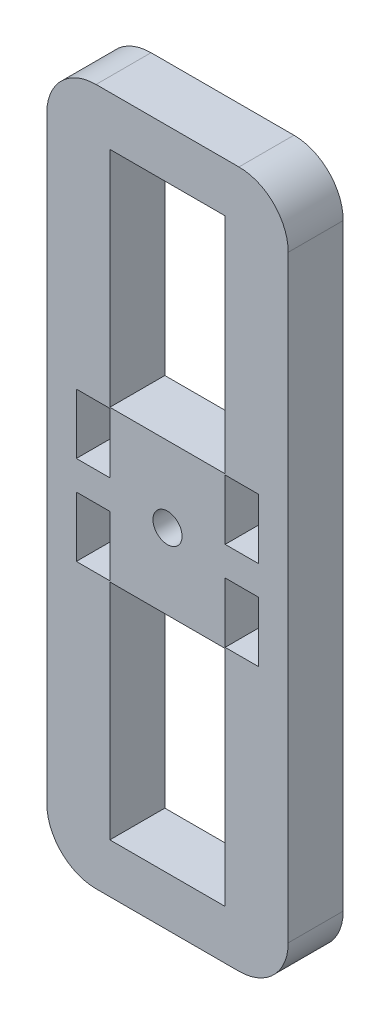
ISO-10303-21;
HEADER;
FILE_DESCRIPTION(('STEP AP214'),'2;1');
FILE_NAME('part.step','',(''),(''),'','','');
FILE_SCHEMA(('AUTOMOTIVE_DESIGN { 1 0 10303 214 1 1 1 1 }'));
ENDSEC;
DATA;
#1=APPLICATION_CONTEXT('core data for automotive mechanical design processes');
#2=APPLICATION_PROTOCOL_DEFINITION('international standard','automotive_design',2000,#1);
#3=PRODUCT_CONTEXT('',#1,'mechanical');
#4=PRODUCT('Part','Part','',(#3));
#5=PRODUCT_RELATED_PRODUCT_CATEGORY('part','',(#4));
#6=PRODUCT_DEFINITION_FORMATION('','',#4);
#7=PRODUCT_DEFINITION_CONTEXT('part definition',#1,'design');
#8=PRODUCT_DEFINITION('design','',#6,#7);
#9=PRODUCT_DEFINITION_SHAPE('','',#8);
#10=(LENGTH_UNIT() NAMED_UNIT(*) SI_UNIT(.MILLI.,.METRE.));
#11=(NAMED_UNIT(*) PLANE_ANGLE_UNIT() SI_UNIT($,.RADIAN.));
#12=(NAMED_UNIT(*) SI_UNIT($,.STERADIAN.) SOLID_ANGLE_UNIT());
#13=UNCERTAINTY_MEASURE_WITH_UNIT(LENGTH_MEASURE(1.E-05),#10,'distance_accuracy_value','');
#14=(GEOMETRIC_REPRESENTATION_CONTEXT(3) GLOBAL_UNCERTAINTY_ASSIGNED_CONTEXT((#13)) GLOBAL_UNIT_ASSIGNED_CONTEXT((#10,
#11,#12)) REPRESENTATION_CONTEXT('',''));
#15=CARTESIAN_POINT('',(0.,0.,0.));
#16=DIRECTION('',(0.,0.,1.));
#17=DIRECTION('',(1.,0.,0.));
#18=AXIS2_PLACEMENT_3D('',#15,#16,#17);
#19=CARTESIAN_POINT('',(715.695729088939,432.610180658426,5.58));
#20=DIRECTION('',(0.,1.,0.));
#21=DIRECTION('',(-1.,0.,0.));
#22=AXIS2_PLACEMENT_3D('',#19,#20,#21);
#23=PLANE('',#22);
#24=DIRECTION('',(1.,0.,0.));
#25=VECTOR('',#24,1.);
#26=CARTESIAN_POINT('',(715.695729088939,432.610180658426,0.));
#27=LINE('',#26,#25);
#28=CARTESIAN_POINT('',(708.445729088938,432.610180658425,0.));
#29=VERTEX_POINT('',#28);
#30=CARTESIAN_POINT('',(722.945729088939,432.610180658425,0.));
#31=VERTEX_POINT('',#30);
#32=EDGE_CURVE('E355',#29,#31,#27,.T.);
#33=ORIENTED_EDGE('',*,*,#32,.T.);
#34=DIRECTION('',(0.,0.,-1.));
#35=VECTOR('',#34,1.);
#36=CARTESIAN_POINT('',(722.945729088939,432.610180658425,5.58));
#37=LINE('',#36,#35);
#38=CARTESIAN_POINT('',(722.945729088939,432.610180658425,5.58));
#39=VERTEX_POINT('',#38);
#40=EDGE_CURVE('E12',#39,#31,#37,.T.);
#41=ORIENTED_EDGE('',*,*,#40,.F.);
#42=DIRECTION('',(1.,0.,0.));
#43=VECTOR('',#42,1.);
#44=CARTESIAN_POINT('',(715.695729088939,432.610180658426,5.58));
#45=LINE('',#44,#43);
#46=CARTESIAN_POINT('',(708.445729088938,432.610180658425,5.58));
#47=VERTEX_POINT('',#46);
#48=EDGE_CURVE('E585',#47,#39,#45,.T.);
#49=ORIENTED_EDGE('',*,*,#48,.F.);
#50=DIRECTION('',(0.,0.,-1.));
#51=VECTOR('',#50,1.);
#52=CARTESIAN_POINT('',(708.445729088938,432.610180658425,5.58));
#53=LINE('',#52,#51);
#54=EDGE_CURVE('E55',#47,#29,#53,.T.);
#55=ORIENTED_EDGE('',*,*,#54,.T.);
#56=EDGE_LOOP('',(#33,#41,#49,#55));
#57=FACE_BOUND('',#56,.T.);
#58=ADVANCED_FACE('F36',(#57),#23,.F.);
#59=CARTESIAN_POINT('',(722.945729088939,437.610180658425,5.58));
#60=DIRECTION('',(0.,0.,-1.));
#61=DIRECTION('',(-1.,0.,0.));
#62=AXIS2_PLACEMENT_3D('',#59,#60,#61);
#63=CYLINDRICAL_SURFACE('',#62,4.99999999999992);
#64=CARTESIAN_POINT('',(722.945729088939,437.610180658425,0.));
#65=DIRECTION('',(0.,0.,1.));
#66=DIRECTION('',(1.,0.,0.));
#67=AXIS2_PLACEMENT_3D('',#64,#65,#66);
#68=CIRCLE('',#67,4.99999999999992);
#69=CARTESIAN_POINT('',(727.945729088939,437.610180658426,0.));
#70=VERTEX_POINT('',#69);
#71=EDGE_CURVE('E357',#31,#70,#68,.T.);
#72=ORIENTED_EDGE('',*,*,#71,.T.);
#73=DIRECTION('',(0.,0.,-1.));
#74=VECTOR('',#73,1.);
#75=CARTESIAN_POINT('',(727.945729088939,437.610180658426,5.58));
#76=LINE('',#75,#74);
#77=CARTESIAN_POINT('',(727.945729088939,437.610180658426,5.58));
#78=VERTEX_POINT('',#77);
#79=EDGE_CURVE('E46',#78,#70,#76,.T.);
#80=ORIENTED_EDGE('',*,*,#79,.F.);
#81=CARTESIAN_POINT('',(722.945729088939,437.610180658425,5.58));
#82=DIRECTION('',(0.,0.,1.));
#83=DIRECTION('',(1.,0.,0.));
#84=AXIS2_PLACEMENT_3D('',#81,#82,#83);
#85=CIRCLE('',#84,4.99999999999992);
#86=EDGE_CURVE('E589',#39,#78,#85,.T.);
#87=ORIENTED_EDGE('',*,*,#86,.F.);
#88=ORIENTED_EDGE('',*,*,#40,.T.);
#89=EDGE_LOOP('',(#72,#80,#87,#88));
#90=FACE_BOUND('',#89,.T.);
#91=ADVANCED_FACE('F613',(#90),#63,.T.);
#92=CARTESIAN_POINT('',(727.945729088939,409.621367447579,5.58));
#93=DIRECTION('',(1.,0.,0.));
#94=DIRECTION('',(0.,1.,0.));
#95=AXIS2_PLACEMENT_3D('',#92,#93,#94);
#96=PLANE('',#95);
#97=DIRECTION('',(0.,-1.,0.));
#98=VECTOR('',#97,1.);
#99=CARTESIAN_POINT('',(727.945729088939,409.621367447579,0.));
#100=LINE('',#99,#98);
#101=CARTESIAN_POINT('',(727.945729088939,498.299163154582,0.));
#102=VERTEX_POINT('',#101);
#103=EDGE_CURVE('E360',#102,#70,#100,.T.);
#104=ORIENTED_EDGE('',*,*,#103,.F.);
#105=DIRECTION('',(0.,0.,-1.));
#106=VECTOR('',#105,1.);
#107=CARTESIAN_POINT('',(727.945729088939,498.299163154582,5.58));
#108=LINE('',#107,#106);
#109=CARTESIAN_POINT('',(727.945729088939,498.299163154582,5.58));
#110=VERTEX_POINT('',#109);
#111=EDGE_CURVE('E382',#110,#102,#108,.T.);
#112=ORIENTED_EDGE('',*,*,#111,.F.);
#113=DIRECTION('',(0.,-1.,0.));
#114=VECTOR('',#113,1.);
#115=CARTESIAN_POINT('',(727.945729088939,409.621367447579,5.58));
#116=LINE('',#115,#114);
#117=EDGE_CURVE('E593',#110,#78,#116,.T.);
#118=ORIENTED_EDGE('',*,*,#117,.T.);
#119=ORIENTED_EDGE('',*,*,#79,.T.);
#120=EDGE_LOOP('',(#104,#112,#118,#119));
#121=FACE_BOUND('',#120,.T.);
#122=ADVANCED_FACE('F609',(#121),#96,.T.);
#123=CARTESIAN_POINT('',(722.945729088939,498.299163154582,5.58));
#124=DIRECTION('',(0.,0.,-1.));
#125=DIRECTION('',(-1.,0.,0.));
#126=AXIS2_PLACEMENT_3D('',#123,#124,#125);
#127=CYLINDRICAL_SURFACE('',#126,4.99999999999987);
#128=CARTESIAN_POINT('',(722.945729088939,498.299163154582,0.));
#129=DIRECTION('',(0.,0.,1.));
#130=DIRECTION('',(1.,0.,0.));
#131=AXIS2_PLACEMENT_3D('',#128,#129,#130);
#132=CIRCLE('',#131,4.99999999999987);
#133=CARTESIAN_POINT('',(722.945729088939,503.299163154582,0.));
#134=VERTEX_POINT('',#133);
#135=EDGE_CURVE('E363',#134,#102,#132,.F.);
#136=ORIENTED_EDGE('',*,*,#135,.F.);
#137=DIRECTION('',(0.,0.,-1.));
#138=VECTOR('',#137,1.);
#139=CARTESIAN_POINT('',(722.945729088939,503.299163154582,5.58));
#140=LINE('',#139,#138);
#141=CARTESIAN_POINT('',(722.945729088939,503.299163154582,5.58));
#142=VERTEX_POINT('',#141);
#143=EDGE_CURVE('E380',#142,#134,#140,.T.);
#144=ORIENTED_EDGE('',*,*,#143,.F.);
#145=CARTESIAN_POINT('',(722.945729088939,498.299163154582,5.58));
#146=DIRECTION('',(0.,0.,1.));
#147=DIRECTION('',(1.,0.,0.));
#148=AXIS2_PLACEMENT_3D('',#145,#146,#147);
#149=CIRCLE('',#148,4.99999999999987);
#150=EDGE_CURVE('E600',#142,#110,#149,.F.);
#151=ORIENTED_EDGE('',*,*,#150,.T.);
#152=ORIENTED_EDGE('',*,*,#111,.T.);
#153=EDGE_LOOP('',(#136,#144,#151,#152));
#154=FACE_BOUND('',#153,.T.);
#155=ADVANCED_FACE('F617',(#154),#127,.T.);
#156=CARTESIAN_POINT('',(715.695729088937,503.299163154582,5.58));
#157=DIRECTION('',(0.,1.,0.));
#158=DIRECTION('',(-1.,0.,0.));
#159=AXIS2_PLACEMENT_3D('',#156,#157,#158);
#160=PLANE('',#159);
#161=DIRECTION('',(1.,0.,0.));
#162=VECTOR('',#161,1.);
#163=CARTESIAN_POINT('',(715.695729088937,503.299163154582,0.));
#164=LINE('',#163,#162);
#165=CARTESIAN_POINT('',(708.445729088938,503.299163154582,0.));
#166=VERTEX_POINT('',#165);
#167=EDGE_CURVE('E366',#166,#134,#164,.T.);
#168=ORIENTED_EDGE('',*,*,#167,.F.);
#169=DIRECTION('',(0.,0.,-1.));
#170=VECTOR('',#169,1.);
#171=CARTESIAN_POINT('',(708.445729088938,503.299163154582,5.58));
#172=LINE('',#171,#170);
#173=CARTESIAN_POINT('',(708.445729088938,503.299163154582,5.58));
#174=VERTEX_POINT('',#173);
#175=EDGE_CURVE('E274',#174,#166,#172,.T.);
#176=ORIENTED_EDGE('',*,*,#175,.F.);
#177=DIRECTION('',(1.,0.,0.));
#178=VECTOR('',#177,1.);
#179=CARTESIAN_POINT('',(715.695729088937,503.299163154582,5.58));
#180=LINE('',#179,#178);
#181=EDGE_CURVE('E263',#174,#142,#180,.T.);
#182=ORIENTED_EDGE('',*,*,#181,.T.);
#183=ORIENTED_EDGE('',*,*,#143,.T.);
#184=EDGE_LOOP('',(#168,#176,#182,#183));
#185=FACE_BOUND('',#184,.T.);
#186=ADVANCED_FACE('F619',(#185),#160,.T.);
#187=CARTESIAN_POINT('',(708.445729088938,498.299163154582,5.58));
#188=DIRECTION('',(0.,0.,-1.));
#189=DIRECTION('',(-1.,0.,0.));
#190=AXIS2_PLACEMENT_3D('',#187,#188,#189);
#191=CYLINDRICAL_SURFACE('',#190,4.99999999999998);
#192=CARTESIAN_POINT('',(708.445729088938,498.299163154582,0.));
#193=DIRECTION('',(0.,0.,1.));
#194=DIRECTION('',(1.,0.,0.));
#195=AXIS2_PLACEMENT_3D('',#192,#193,#194);
#196=CIRCLE('',#195,4.99999999999998);
#197=CARTESIAN_POINT('',(703.445729088938,498.299163154582,0.));
#198=VERTEX_POINT('',#197);
#199=EDGE_CURVE('E271',#166,#198,#196,.T.);
#200=ORIENTED_EDGE('',*,*,#199,.T.);
#201=DIRECTION('',(0.,0.,-1.));
#202=VECTOR('',#201,1.);
#203=CARTESIAN_POINT('',(703.445729088938,498.299163154582,5.58));
#204=LINE('',#203,#202);
#205=CARTESIAN_POINT('',(703.445729088938,498.299163154582,5.58));
#206=VERTEX_POINT('',#205);
#207=EDGE_CURVE('E268',#206,#198,#204,.T.);
#208=ORIENTED_EDGE('',*,*,#207,.F.);
#209=CARTESIAN_POINT('',(708.445729088938,498.299163154582,5.58));
#210=DIRECTION('',(0.,0.,1.));
#211=DIRECTION('',(1.,0.,0.));
#212=AXIS2_PLACEMENT_3D('',#209,#210,#211);
#213=CIRCLE('',#212,4.99999999999998);
#214=EDGE_CURVE('E254',#174,#206,#213,.T.);
#215=ORIENTED_EDGE('',*,*,#214,.F.);
#216=ORIENTED_EDGE('',*,*,#175,.T.);
#217=EDGE_LOOP('',(#200,#208,#215,#216));
#218=FACE_BOUND('',#217,.T.);
#219=ADVANCED_FACE('F269',(#218),#191,.T.);
#220=CARTESIAN_POINT('',(703.445729088938,409.621367447579,5.58));
#221=DIRECTION('',(1.,0.,0.));
#222=DIRECTION('',(0.,0.,-1.));
#223=AXIS2_PLACEMENT_3D('',#220,#221,#222);
#224=PLANE('',#223);
#225=DIRECTION('',(0.,-1.,0.));
#226=VECTOR('',#225,1.);
#227=CARTESIAN_POINT('',(703.445729088938,409.621367447579,0.));
#228=LINE('',#227,#226);
#229=CARTESIAN_POINT('',(703.445729088938,437.610180658426,0.));
#230=VERTEX_POINT('',#229);
#231=EDGE_CURVE('E370',#198,#230,#228,.T.);
#232=ORIENTED_EDGE('',*,*,#231,.T.);
#233=DIRECTION('',(0.,0.,-1.));
#234=VECTOR('',#233,1.);
#235=CARTESIAN_POINT('',(703.445729088938,437.610180658426,5.58));
#236=LINE('',#235,#234);
#237=CARTESIAN_POINT('',(703.445729088938,437.610180658426,5.58));
#238=VERTEX_POINT('',#237);
#239=EDGE_CURVE('E154',#238,#230,#236,.T.);
#240=ORIENTED_EDGE('',*,*,#239,.F.);
#241=DIRECTION('',(0.,-1.,0.));
#242=VECTOR('',#241,1.);
#243=CARTESIAN_POINT('',(703.445729088938,409.621367447579,5.58));
#244=LINE('',#243,#242);
#245=EDGE_CURVE('E260',#206,#238,#244,.T.);
#246=ORIENTED_EDGE('',*,*,#245,.F.);
#247=ORIENTED_EDGE('',*,*,#207,.T.);
#248=EDGE_LOOP('',(#232,#240,#246,#247));
#249=FACE_BOUND('',#248,.T.);
#250=ADVANCED_FACE('F276',(#249),#224,.F.);
#251=CARTESIAN_POINT('',(715.695729088938,437.610180658425,5.58));
#252=DIRECTION('',(0.,1.,0.));
#253=DIRECTION('',(0.,0.,1.));
#254=AXIS2_PLACEMENT_3D('',#251,#252,#253);
#255=PLANE('',#254);
#256=DIRECTION('',(1.,0.,0.));
#257=VECTOR('',#256,1.);
#258=CARTESIAN_POINT('',(715.695729088938,437.610180658425,0.));
#259=LINE('',#258,#257);
#260=CARTESIAN_POINT('',(709.845729088938,437.610180658426,0.));
#261=VERTEX_POINT('',#260);
#262=CARTESIAN_POINT('',(721.545729088939,437.610180658426,0.));
#263=VERTEX_POINT('',#262);
#264=EDGE_CURVE('E340',#261,#263,#259,.T.);
#265=ORIENTED_EDGE('',*,*,#264,.F.);
#266=DIRECTION('',(0.,0.,-1.));
#267=VECTOR('',#266,1.);
#268=CARTESIAN_POINT('',(709.845729088938,437.610180658426,5.58));
#269=LINE('',#268,#267);
#270=CARTESIAN_POINT('',(709.845729088938,437.610180658426,5.58));
#271=VERTEX_POINT('',#270);
#272=EDGE_CURVE('E377',#271,#261,#269,.T.);
#273=ORIENTED_EDGE('',*,*,#272,.F.);
#274=DIRECTION('',(1.,0.,0.));
#275=VECTOR('',#274,1.);
#276=CARTESIAN_POINT('',(715.695729088938,437.610180658425,5.58));
#277=LINE('',#276,#275);
#278=CARTESIAN_POINT('',(721.545729088939,437.610180658426,5.58));
#279=VERTEX_POINT('',#278);
#280=EDGE_CURVE('E559',#271,#279,#277,.T.);
#281=ORIENTED_EDGE('',*,*,#280,.T.);
#282=DIRECTION('',(0.,0.,-1.));
#283=VECTOR('',#282,1.);
#284=CARTESIAN_POINT('',(721.545729088939,437.610180658426,5.58));
#285=LINE('',#284,#283);
#286=EDGE_CURVE('E385',#279,#263,#285,.T.);
#287=ORIENTED_EDGE('',*,*,#286,.T.);
#288=EDGE_LOOP('',(#265,#273,#281,#287));
#289=FACE_BOUND('',#288,.T.);
#290=ADVANCED_FACE('F657',(#289),#255,.T.);
#291=CARTESIAN_POINT('',(709.845729088938,409.621367447579,5.58));
#292=DIRECTION('',(1.,0.,0.));
#293=DIRECTION('',(0.,0.,-1.));
#294=AXIS2_PLACEMENT_3D('',#291,#292,#293);
#295=PLANE('',#294);
#296=DIRECTION('',(0.,-1.,0.));
#297=VECTOR('',#296,1.);
#298=CARTESIAN_POINT('',(709.845729088938,409.621367447579,0.));
#299=LINE('',#298,#297);
#300=CARTESIAN_POINT('',(709.845729088938,460.279671906504,0.));
#301=VERTEX_POINT('',#300);
#302=EDGE_CURVE('E343',#301,#261,#299,.T.);
#303=ORIENTED_EDGE('',*,*,#302,.F.);
#304=DIRECTION('',(0.,0.,-1.));
#305=VECTOR('',#304,1.);
#306=CARTESIAN_POINT('',(709.845729088938,460.279671906504,5.58));
#307=LINE('',#306,#305);
#308=CARTESIAN_POINT('',(709.845729088938,460.279671906504,5.58));
#309=VERTEX_POINT('',#308);
#310=EDGE_CURVE('E390',#309,#301,#307,.T.);
#311=ORIENTED_EDGE('',*,*,#310,.F.);
#312=DIRECTION('',(0.,-1.,0.));
#313=VECTOR('',#312,1.);
#314=CARTESIAN_POINT('',(709.845729088938,409.621367447579,5.58));
#315=LINE('',#314,#313);
#316=EDGE_CURVE('E563',#309,#271,#315,.T.);
#317=ORIENTED_EDGE('',*,*,#316,.T.);
#318=ORIENTED_EDGE('',*,*,#272,.T.);
#319=EDGE_LOOP('',(#303,#311,#317,#318));
#320=FACE_BOUND('',#319,.T.);
#321=ADVANCED_FACE('F653',(#320),#295,.T.);
#322=CARTESIAN_POINT('',(715.695729088938,460.279671906504,5.58));
#323=DIRECTION('',(0.,-1.,0.));
#324=DIRECTION('',(0.,0.,-1.));
#325=AXIS2_PLACEMENT_3D('',#322,#323,#324);
#326=PLANE('',#325);
#327=DIRECTION('',(-1.,0.,0.));
#328=VECTOR('',#327,1.);
#329=CARTESIAN_POINT('',(715.695729088938,460.279671906504,0.));
#330=LINE('',#329,#328);
#331=CARTESIAN_POINT('',(721.545729088939,460.279671906504,0.));
#332=VERTEX_POINT('',#331);
#333=EDGE_CURVE('E346',#332,#301,#330,.T.);
#334=ORIENTED_EDGE('',*,*,#333,.F.);
#335=DIRECTION('',(0.,0.,-1.));
#336=VECTOR('',#335,1.);
#337=CARTESIAN_POINT('',(721.545729088939,460.279671906504,5.58));
#338=LINE('',#337,#336);
#339=CARTESIAN_POINT('',(721.545729088939,460.279671906504,5.58));
#340=VERTEX_POINT('',#339);
#341=EDGE_CURVE('E387',#340,#332,#338,.T.);
#342=ORIENTED_EDGE('',*,*,#341,.F.);
#343=DIRECTION('',(-1.,0.,0.));
#344=VECTOR('',#343,1.);
#345=CARTESIAN_POINT('',(715.695729088938,460.279671906504,5.58));
#346=LINE('',#345,#344);
#347=EDGE_CURVE('E568',#340,#309,#346,.T.);
#348=ORIENTED_EDGE('',*,*,#347,.T.);
#349=ORIENTED_EDGE('',*,*,#310,.T.);
#350=EDGE_LOOP('',(#334,#342,#348,#349));
#351=FACE_BOUND('',#350,.T.);
#352=ADVANCED_FACE('F649',(#351),#326,.T.);
#353=CARTESIAN_POINT('',(709.845729088938,409.621367447579,5.58));
#354=DIRECTION('',(-1.,0.,0.));
#355=DIRECTION('',(0.,0.,1.));
#356=AXIS2_PLACEMENT_3D('',#353,#354,#355);
#357=PLANE('',#356);
#358=DIRECTION('',(0.,1.,0.));
#359=VECTOR('',#358,1.);
#360=CARTESIAN_POINT('',(709.845729088938,409.621367447579,0.));
#361=LINE('',#360,#359);
#362=CARTESIAN_POINT('',(709.845729088938,460.379671906504,0.));
#363=VERTEX_POINT('',#362);
#364=CARTESIAN_POINT('',(709.845729088938,466.479671906504,0.));
#365=VERTEX_POINT('',#364);
#366=EDGE_CURVE('E328',#363,#365,#361,.T.);
#367=ORIENTED_EDGE('',*,*,#366,.F.);
#368=DIRECTION('',(0.,0.,-1.));
#369=VECTOR('',#368,1.);
#370=CARTESIAN_POINT('',(709.845729088938,460.379671906504,5.58));
#371=LINE('',#370,#369);
#372=CARTESIAN_POINT('',(709.845729088938,460.379671906504,5.58));
#373=VERTEX_POINT('',#372);
#374=EDGE_CURVE('E388',#373,#363,#371,.T.);
#375=ORIENTED_EDGE('',*,*,#374,.F.);
#376=DIRECTION('',(0.,1.,0.));
#377=VECTOR('',#376,1.);
#378=CARTESIAN_POINT('',(709.845729088938,409.621367447579,5.58));
#379=LINE('',#378,#377);
#380=CARTESIAN_POINT('',(709.845729088938,466.479671906504,5.58));
#381=VERTEX_POINT('',#380);
#382=EDGE_CURVE('E538',#373,#381,#379,.T.);
#383=ORIENTED_EDGE('',*,*,#382,.T.);
#384=DIRECTION('',(0.,0.,-1.));
#385=VECTOR('',#384,1.);
#386=CARTESIAN_POINT('',(709.845729088938,466.479671906504,5.58));
#387=LINE('',#386,#385);
#388=EDGE_CURVE('E393',#381,#365,#387,.T.);
#389=ORIENTED_EDGE('',*,*,#388,.T.);
#390=EDGE_LOOP('',(#367,#375,#383,#389));
#391=FACE_BOUND('',#390,.T.);
#392=ADVANCED_FACE('F652',(#391),#357,.T.);
#393=CARTESIAN_POINT('',(715.695729088938,460.379671906504,5.58));
#394=DIRECTION('',(0.,-1.,0.));
#395=DIRECTION('',(0.,0.,-1.));
#396=AXIS2_PLACEMENT_3D('',#393,#394,#395);
#397=PLANE('',#396);
#398=DIRECTION('',(-1.,0.,0.));
#399=VECTOR('',#398,1.);
#400=CARTESIAN_POINT('',(715.695729088938,460.379671906504,0.));
#401=LINE('',#400,#399);
#402=CARTESIAN_POINT('',(706.445729088938,460.379671906504,0.));
#403=VERTEX_POINT('',#402);
#404=EDGE_CURVE('E331',#363,#403,#401,.T.);
#405=ORIENTED_EDGE('',*,*,#404,.T.);
#406=DIRECTION('',(0.,0.,-1.));
#407=VECTOR('',#406,1.);
#408=CARTESIAN_POINT('',(706.445729088938,460.379671906504,5.58));
#409=LINE('',#408,#407);
#410=CARTESIAN_POINT('',(706.445729088938,460.379671906504,5.58));
#411=VERTEX_POINT('',#410);
#412=EDGE_CURVE('E398',#411,#403,#409,.T.);
#413=ORIENTED_EDGE('',*,*,#412,.F.);
#414=DIRECTION('',(-1.,0.,0.));
#415=VECTOR('',#414,1.);
#416=CARTESIAN_POINT('',(715.695729088938,460.379671906504,5.58));
#417=LINE('',#416,#415);
#418=EDGE_CURVE('E542',#373,#411,#417,.T.);
#419=ORIENTED_EDGE('',*,*,#418,.F.);
#420=ORIENTED_EDGE('',*,*,#374,.T.);
#421=EDGE_LOOP('',(#405,#413,#419,#420));
#422=FACE_BOUND('',#421,.T.);
#423=ADVANCED_FACE('F670',(#422),#397,.F.);
#424=CARTESIAN_POINT('',(706.445729088938,409.621367447579,5.58));
#425=DIRECTION('',(1.,0.,0.));
#426=DIRECTION('',(0.,0.,-1.));
#427=AXIS2_PLACEMENT_3D('',#424,#425,#426);
#428=PLANE('',#427);
#429=DIRECTION('',(0.,-1.,0.));
#430=VECTOR('',#429,1.);
#431=CARTESIAN_POINT('',(706.445729088938,409.621367447579,0.));
#432=LINE('',#431,#430);
#433=CARTESIAN_POINT('',(706.445729088938,466.479671906504,0.));
#434=VERTEX_POINT('',#433);
#435=EDGE_CURVE('E334',#434,#403,#432,.T.);
#436=ORIENTED_EDGE('',*,*,#435,.F.);
#437=DIRECTION('',(0.,0.,-1.));
#438=VECTOR('',#437,1.);
#439=CARTESIAN_POINT('',(706.445729088938,466.479671906504,5.58));
#440=LINE('',#439,#438);
#441=CARTESIAN_POINT('',(706.445729088938,466.479671906504,5.58));
#442=VERTEX_POINT('',#441);
#443=EDGE_CURVE('E395',#442,#434,#440,.T.);
#444=ORIENTED_EDGE('',*,*,#443,.F.);
#445=DIRECTION('',(0.,-1.,0.));
#446=VECTOR('',#445,1.);
#447=CARTESIAN_POINT('',(706.445729088938,409.621367447579,5.58));
#448=LINE('',#447,#446);
#449=EDGE_CURVE('E546',#442,#411,#448,.T.);
#450=ORIENTED_EDGE('',*,*,#449,.T.);
#451=ORIENTED_EDGE('',*,*,#412,.T.);
#452=EDGE_LOOP('',(#436,#444,#450,#451));
#453=FACE_BOUND('',#452,.T.);
#454=ADVANCED_FACE('F666',(#453),#428,.T.);
#455=CARTESIAN_POINT('',(715.695729088938,469.429671906504,5.58));
#456=DIRECTION('',(0.,-1.,0.));
#457=DIRECTION('',(0.,0.,-1.));
#458=AXIS2_PLACEMENT_3D('',#455,#456,#457);
#459=PLANE('',#458);
#460=DIRECTION('',(-1.,0.,0.));
#461=VECTOR('',#460,1.);
#462=CARTESIAN_POINT('',(715.695729088938,469.429671906504,0.));
#463=LINE('',#462,#461);
#464=CARTESIAN_POINT('',(709.845729088938,469.429671906504,0.));
#465=VERTEX_POINT('',#464);
#466=CARTESIAN_POINT('',(706.445729088938,469.429671906504,0.));
#467=VERTEX_POINT('',#466);
#468=EDGE_CURVE('E317',#465,#467,#463,.T.);
#469=ORIENTED_EDGE('',*,*,#468,.T.);
#470=DIRECTION('',(0.,0.,-1.));
#471=VECTOR('',#470,1.);
#472=CARTESIAN_POINT('',(706.445729088938,469.429671906504,5.58));
#473=LINE('',#472,#471);
#474=CARTESIAN_POINT('',(706.445729088938,469.429671906504,5.58));
#475=VERTEX_POINT('',#474);
#476=EDGE_CURVE('E396',#475,#467,#473,.T.);
#477=ORIENTED_EDGE('',*,*,#476,.F.);
#478=DIRECTION('',(-1.,0.,0.));
#479=VECTOR('',#478,1.);
#480=CARTESIAN_POINT('',(715.695729088938,469.429671906504,5.58));
#481=LINE('',#480,#479);
#482=CARTESIAN_POINT('',(709.845729088938,469.429671906504,5.58));
#483=VERTEX_POINT('',#482);
#484=EDGE_CURVE('E517',#483,#475,#481,.T.);
#485=ORIENTED_EDGE('',*,*,#484,.F.);
#486=DIRECTION('',(0.,0.,-1.));
#487=VECTOR('',#486,1.);
#488=CARTESIAN_POINT('',(709.845729088938,469.429671906504,5.58));
#489=LINE('',#488,#487);
#490=EDGE_CURVE('E401',#483,#465,#489,.T.);
#491=ORIENTED_EDGE('',*,*,#490,.T.);
#492=EDGE_LOOP('',(#469,#477,#485,#491));
#493=FACE_BOUND('',#492,.T.);
#494=ADVANCED_FACE('F669',(#493),#459,.F.);
#495=CARTESIAN_POINT('',(706.445729088938,409.621367447579,5.58));
#496=DIRECTION('',(-1.,0.,0.));
#497=DIRECTION('',(0.,0.,1.));
#498=AXIS2_PLACEMENT_3D('',#495,#496,#497);
#499=PLANE('',#498);
#500=DIRECTION('',(0.,1.,0.));
#501=VECTOR('',#500,1.);
#502=CARTESIAN_POINT('',(706.445729088938,409.621367447579,0.));
#503=LINE('',#502,#501);
#504=CARTESIAN_POINT('',(706.445729088938,475.529671906504,0.));
#505=VERTEX_POINT('',#504);
#506=EDGE_CURVE('E320',#467,#505,#503,.T.);
#507=ORIENTED_EDGE('',*,*,#506,.T.);
#508=DIRECTION('',(0.,0.,-1.));
#509=VECTOR('',#508,1.);
#510=CARTESIAN_POINT('',(706.445729088938,475.529671906504,5.58));
#511=LINE('',#510,#509);
#512=CARTESIAN_POINT('',(706.445729088938,475.529671906504,5.58));
#513=VERTEX_POINT('',#512);
#514=EDGE_CURVE('E407',#513,#505,#511,.T.);
#515=ORIENTED_EDGE('',*,*,#514,.F.);
#516=DIRECTION('',(0.,1.,0.));
#517=VECTOR('',#516,1.);
#518=CARTESIAN_POINT('',(706.445729088938,409.621367447579,5.58));
#519=LINE('',#518,#517);
#520=EDGE_CURVE('E521',#475,#513,#519,.T.);
#521=ORIENTED_EDGE('',*,*,#520,.F.);
#522=ORIENTED_EDGE('',*,*,#476,.T.);
#523=EDGE_LOOP('',(#507,#515,#521,#522));
#524=FACE_BOUND('',#523,.T.);
#525=ADVANCED_FACE('F686',(#524),#499,.F.);
#526=CARTESIAN_POINT('',(715.695729088938,475.529671906504,5.58));
#527=DIRECTION('',(0.,-1.,0.));
#528=DIRECTION('',(0.,0.,-1.));
#529=AXIS2_PLACEMENT_3D('',#526,#527,#528);
#530=PLANE('',#529);
#531=DIRECTION('',(-1.,0.,0.));
#532=VECTOR('',#531,1.);
#533=CARTESIAN_POINT('',(715.695729088938,475.529671906504,0.));
#534=LINE('',#533,#532);
#535=CARTESIAN_POINT('',(709.845729088938,475.529671906504,0.));
#536=VERTEX_POINT('',#535);
#537=EDGE_CURVE('E323',#536,#505,#534,.T.);
#538=ORIENTED_EDGE('',*,*,#537,.F.);
#539=DIRECTION('',(0.,0.,-1.));
#540=VECTOR('',#539,1.);
#541=CARTESIAN_POINT('',(709.845729088938,475.529671906504,5.58));
#542=LINE('',#541,#540);
#543=CARTESIAN_POINT('',(709.845729088938,475.529671906504,5.58));
#544=VERTEX_POINT('',#543);
#545=EDGE_CURVE('E404',#544,#536,#542,.T.);
#546=ORIENTED_EDGE('',*,*,#545,.F.);
#547=DIRECTION('',(-1.,0.,0.));
#548=VECTOR('',#547,1.);
#549=CARTESIAN_POINT('',(715.695729088938,475.529671906504,5.58));
#550=LINE('',#549,#548);
#551=EDGE_CURVE('E525',#544,#513,#550,.T.);
#552=ORIENTED_EDGE('',*,*,#551,.T.);
#553=ORIENTED_EDGE('',*,*,#514,.T.);
#554=EDGE_LOOP('',(#538,#546,#552,#553));
#555=FACE_BOUND('',#554,.T.);
#556=ADVANCED_FACE('F682',(#555),#530,.T.);
#557=CARTESIAN_POINT('',(715.695729088938,475.629671906504,5.58));
#558=DIRECTION('',(0.,-1.,0.));
#559=DIRECTION('',(0.,0.,-1.));
#560=AXIS2_PLACEMENT_3D('',#557,#558,#559);
#561=PLANE('',#560);
#562=DIRECTION('',(-1.,0.,0.));
#563=VECTOR('',#562,1.);
#564=CARTESIAN_POINT('',(715.695729088938,475.629671906504,0.));
#565=LINE('',#564,#563);
#566=CARTESIAN_POINT('',(721.545729088939,475.629671906504,0.));
#567=VERTEX_POINT('',#566);
#568=CARTESIAN_POINT('',(709.845729088938,475.629671906504,0.));
#569=VERTEX_POINT('',#568);
#570=EDGE_CURVE('E308',#567,#569,#565,.T.);
#571=ORIENTED_EDGE('',*,*,#570,.T.);
#572=DIRECTION('',(0.,0.,-1.));
#573=VECTOR('',#572,1.);
#574=CARTESIAN_POINT('',(709.845729088938,475.629671906504,5.58));
#575=LINE('',#574,#573);
#576=CARTESIAN_POINT('',(709.845729088938,475.629671906504,5.58));
#577=VERTEX_POINT('',#576);
#578=EDGE_CURVE('E405',#577,#569,#575,.T.);
#579=ORIENTED_EDGE('',*,*,#578,.F.);
#580=DIRECTION('',(-1.,0.,0.));
#581=VECTOR('',#580,1.);
#582=CARTESIAN_POINT('',(715.695729088938,475.629671906504,5.58));
#583=LINE('',#582,#581);
#584=CARTESIAN_POINT('',(721.545729088939,475.629671906504,5.58));
#585=VERTEX_POINT('',#584);
#586=EDGE_CURVE('E497',#585,#577,#583,.T.);
#587=ORIENTED_EDGE('',*,*,#586,.F.);
#588=DIRECTION('',(0.,0.,-1.));
#589=VECTOR('',#588,1.);
#590=CARTESIAN_POINT('',(721.545729088939,475.629671906504,5.58));
#591=LINE('',#590,#589);
#592=EDGE_CURVE('E411',#585,#567,#591,.T.);
#593=ORIENTED_EDGE('',*,*,#592,.T.);
#594=EDGE_LOOP('',(#571,#579,#587,#593));
#595=FACE_BOUND('',#594,.T.);
#596=ADVANCED_FACE('F685',(#595),#561,.F.);
#597=CARTESIAN_POINT('',(709.845729088938,409.621367447579,5.58));
#598=DIRECTION('',(-1.,0.,0.));
#599=DIRECTION('',(0.,0.,1.));
#600=AXIS2_PLACEMENT_3D('',#597,#598,#599);
#601=PLANE('',#600);
#602=DIRECTION('',(0.,1.,0.));
#603=VECTOR('',#602,1.);
#604=CARTESIAN_POINT('',(709.845729088938,409.621367447579,0.));
#605=LINE('',#604,#603);
#606=CARTESIAN_POINT('',(709.845729088938,498.299163154582,0.));
#607=VERTEX_POINT('',#606);
#608=EDGE_CURVE('E311',#569,#607,#605,.T.);
#609=ORIENTED_EDGE('',*,*,#608,.T.);
#610=DIRECTION('',(0.,0.,-1.));
#611=VECTOR('',#610,1.);
#612=CARTESIAN_POINT('',(709.845729088938,498.299163154582,5.58));
#613=LINE('',#612,#611);
#614=CARTESIAN_POINT('',(709.845729088938,498.299163154582,5.58));
#615=VERTEX_POINT('',#614);
#616=EDGE_CURVE('E418',#615,#607,#613,.T.);
#617=ORIENTED_EDGE('',*,*,#616,.F.);
#618=DIRECTION('',(0.,1.,0.));
#619=VECTOR('',#618,1.);
#620=CARTESIAN_POINT('',(709.845729088938,409.621367447579,5.58));
#621=LINE('',#620,#619);
#622=EDGE_CURVE('E501',#577,#615,#621,.T.);
#623=ORIENTED_EDGE('',*,*,#622,.F.);
#624=ORIENTED_EDGE('',*,*,#578,.T.);
#625=EDGE_LOOP('',(#609,#617,#623,#624));
#626=FACE_BOUND('',#625,.T.);
#627=ADVANCED_FACE('F701',(#626),#601,.F.);
#628=CARTESIAN_POINT('',(715.695729088938,498.299163154582,5.58));
#629=DIRECTION('',(0.,1.,0.));
#630=DIRECTION('',(0.,0.,1.));
#631=AXIS2_PLACEMENT_3D('',#628,#629,#630);
#632=PLANE('',#631);
#633=DIRECTION('',(1.,0.,0.));
#634=VECTOR('',#633,1.);
#635=CARTESIAN_POINT('',(715.695729088938,498.299163154582,0.));
#636=LINE('',#635,#634);
#637=CARTESIAN_POINT('',(721.545729088939,498.299163154582,0.));
#638=VERTEX_POINT('',#637);
#639=EDGE_CURVE('E313',#607,#638,#636,.T.);
#640=ORIENTED_EDGE('',*,*,#639,.T.);
#641=DIRECTION('',(0.,0.,-1.));
#642=VECTOR('',#641,1.);
#643=CARTESIAN_POINT('',(721.545729088939,498.299163154582,5.58));
#644=LINE('',#643,#642);
#645=CARTESIAN_POINT('',(721.545729088939,498.299163154582,5.58));
#646=VERTEX_POINT('',#645);
#647=EDGE_CURVE('E414',#646,#638,#644,.T.);
#648=ORIENTED_EDGE('',*,*,#647,.F.);
#649=DIRECTION('',(1.,0.,0.));
#650=VECTOR('',#649,1.);
#651=CARTESIAN_POINT('',(715.695729088938,498.299163154582,5.58));
#652=LINE('',#651,#650);
#653=EDGE_CURVE('E505',#615,#646,#652,.T.);
#654=ORIENTED_EDGE('',*,*,#653,.F.);
#655=ORIENTED_EDGE('',*,*,#616,.T.);
#656=EDGE_LOOP('',(#640,#648,#654,#655));
#657=FACE_BOUND('',#656,.T.);
#658=ADVANCED_FACE('F697',(#657),#632,.F.);
#659=CARTESIAN_POINT('',(721.545729088939,409.621367447579,5.58));
#660=DIRECTION('',(1.,0.,0.));
#661=DIRECTION('',(0.,0.,-1.));
#662=AXIS2_PLACEMENT_3D('',#659,#660,#661);
#663=PLANE('',#662);
#664=DIRECTION('',(0.,-1.,0.));
#665=VECTOR('',#664,1.);
#666=CARTESIAN_POINT('',(721.545729088939,409.621367447579,0.));
#667=LINE('',#666,#665);
#668=CARTESIAN_POINT('',(721.545729088939,475.529671906504,0.));
#669=VERTEX_POINT('',#668);
#670=CARTESIAN_POINT('',(721.545729088939,469.429671906504,0.));
#671=VERTEX_POINT('',#670);
#672=EDGE_CURVE('E296',#669,#671,#667,.T.);
#673=ORIENTED_EDGE('',*,*,#672,.F.);
#674=DIRECTION('',(0.,0.,-1.));
#675=VECTOR('',#674,1.);
#676=CARTESIAN_POINT('',(721.545729088939,475.529671906504,5.58));
#677=LINE('',#676,#675);
#678=CARTESIAN_POINT('',(721.545729088939,475.529671906504,5.58));
#679=VERTEX_POINT('',#678);
#680=EDGE_CURVE('E415',#679,#669,#677,.T.);
#681=ORIENTED_EDGE('',*,*,#680,.F.);
#682=DIRECTION('',(0.,-1.,0.));
#683=VECTOR('',#682,1.);
#684=CARTESIAN_POINT('',(721.545729088939,409.621367447579,5.58));
#685=LINE('',#684,#683);
#686=CARTESIAN_POINT('',(721.545729088939,469.429671906504,5.58));
#687=VERTEX_POINT('',#686);
#688=EDGE_CURVE('E461',#679,#687,#685,.T.);
#689=ORIENTED_EDGE('',*,*,#688,.T.);
#690=DIRECTION('',(0.,0.,-1.));
#691=VECTOR('',#690,1.);
#692=CARTESIAN_POINT('',(721.545729088939,469.429671906504,5.58));
#693=LINE('',#692,#691);
#694=EDGE_CURVE('E423',#687,#671,#693,.T.);
#695=ORIENTED_EDGE('',*,*,#694,.T.);
#696=EDGE_LOOP('',(#673,#681,#689,#695));
#697=FACE_BOUND('',#696,.T.);
#698=ADVANCED_FACE('F700',(#697),#663,.T.);
#699=CARTESIAN_POINT('',(715.695729088938,475.529671906504,5.58));
#700=DIRECTION('',(0.,1.,0.));
#701=DIRECTION('',(0.,0.,1.));
#702=AXIS2_PLACEMENT_3D('',#699,#700,#701);
#703=PLANE('',#702);
#704=DIRECTION('',(1.,0.,0.));
#705=VECTOR('',#704,1.);
#706=CARTESIAN_POINT('',(715.695729088938,475.529671906504,0.));
#707=LINE('',#706,#705);
#708=CARTESIAN_POINT('',(724.945729088938,475.529671906504,0.));
#709=VERTEX_POINT('',#708);
#710=EDGE_CURVE('E299',#669,#709,#707,.T.);
#711=ORIENTED_EDGE('',*,*,#710,.T.);
#712=DIRECTION('',(0.,0.,-1.));
#713=VECTOR('',#712,1.);
#714=CARTESIAN_POINT('',(724.945729088938,475.529671906504,5.58));
#715=LINE('',#714,#713);
#716=CARTESIAN_POINT('',(724.945729088938,475.529671906504,5.58));
#717=VERTEX_POINT('',#716);
#718=EDGE_CURVE('E427',#717,#709,#715,.T.);
#719=ORIENTED_EDGE('',*,*,#718,.F.);
#720=DIRECTION('',(1.,0.,0.));
#721=VECTOR('',#720,1.);
#722=CARTESIAN_POINT('',(715.695729088938,475.529671906504,5.58));
#723=LINE('',#722,#721);
#724=EDGE_CURVE('E480',#679,#717,#723,.T.);
#725=ORIENTED_EDGE('',*,*,#724,.F.);
#726=ORIENTED_EDGE('',*,*,#680,.T.);
#727=EDGE_LOOP('',(#711,#719,#725,#726));
#728=FACE_BOUND('',#727,.T.);
#729=ADVANCED_FACE('F715',(#728),#703,.F.);
#730=CARTESIAN_POINT('',(724.945729088938,409.621367447579,5.58));
#731=DIRECTION('',(-1.,0.,0.));
#732=DIRECTION('',(0.,0.,1.));
#733=AXIS2_PLACEMENT_3D('',#730,#731,#732);
#734=PLANE('',#733);
#735=DIRECTION('',(0.,1.,0.));
#736=VECTOR('',#735,1.);
#737=CARTESIAN_POINT('',(724.945729088938,409.621367447579,0.));
#738=LINE('',#737,#736);
#739=CARTESIAN_POINT('',(724.945729088938,469.429671906504,0.));
#740=VERTEX_POINT('',#739);
#741=EDGE_CURVE('E302',#740,#709,#738,.T.);
#742=ORIENTED_EDGE('',*,*,#741,.F.);
#743=DIRECTION('',(0.,0.,-1.));
#744=VECTOR('',#743,1.);
#745=CARTESIAN_POINT('',(724.945729088938,469.429671906504,5.58));
#746=LINE('',#745,#744);
#747=CARTESIAN_POINT('',(724.945729088938,469.429671906504,5.58));
#748=VERTEX_POINT('',#747);
#749=EDGE_CURVE('E425',#748,#740,#746,.T.);
#750=ORIENTED_EDGE('',*,*,#749,.F.);
#751=DIRECTION('',(0.,1.,0.));
#752=VECTOR('',#751,1.);
#753=CARTESIAN_POINT('',(724.945729088938,409.621367447579,5.58));
#754=LINE('',#753,#752);
#755=EDGE_CURVE('E484',#748,#717,#754,.T.);
#756=ORIENTED_EDGE('',*,*,#755,.T.);
#757=ORIENTED_EDGE('',*,*,#718,.T.);
#758=EDGE_LOOP('',(#742,#750,#756,#757));
#759=FACE_BOUND('',#758,.T.);
#760=ADVANCED_FACE('F712',(#759),#734,.T.);
#761=CARTESIAN_POINT('',(715.695729088938,460.379671906504,5.58));
#762=DIRECTION('',(0.,1.,0.));
#763=DIRECTION('',(0.,0.,1.));
#764=AXIS2_PLACEMENT_3D('',#761,#762,#763);
#765=PLANE('',#764);
#766=DIRECTION('',(1.,0.,0.));
#767=VECTOR('',#766,1.);
#768=CARTESIAN_POINT('',(715.695729088938,460.379671906504,0.));
#769=LINE('',#768,#767);
#770=CARTESIAN_POINT('',(721.545729088939,460.379671906504,0.));
#771=VERTEX_POINT('',#770);
#772=CARTESIAN_POINT('',(724.945729088938,460.379671906504,0.));
#773=VERTEX_POINT('',#772);
#774=EDGE_CURVE('E286',#771,#773,#769,.T.);
#775=ORIENTED_EDGE('',*,*,#774,.F.);
#776=DIRECTION('',(0.,0.,-1.));
#777=VECTOR('',#776,1.);
#778=CARTESIAN_POINT('',(721.545729088939,460.379671906504,5.58));
#779=LINE('',#778,#777);
#780=CARTESIAN_POINT('',(721.545729088939,460.379671906504,5.58));
#781=VERTEX_POINT('',#780);
#782=EDGE_CURVE('E40',#781,#771,#779,.T.);
#783=ORIENTED_EDGE('',*,*,#782,.F.);
#784=DIRECTION('',(1.,0.,0.));
#785=VECTOR('',#784,1.);
#786=CARTESIAN_POINT('',(715.695729088938,460.379671906504,5.58));
#787=LINE('',#786,#785);
#788=CARTESIAN_POINT('',(724.945729088938,460.379671906504,5.58));
#789=VERTEX_POINT('',#788);
#790=EDGE_CURVE('E375',#781,#789,#787,.T.);
#791=ORIENTED_EDGE('',*,*,#790,.T.);
#792=DIRECTION('',(0.,0.,-1.));
#793=VECTOR('',#792,1.);
#794=CARTESIAN_POINT('',(724.945729088938,460.379671906504,5.58));
#795=LINE('',#794,#793);
#796=EDGE_CURVE('E280',#789,#773,#795,.T.);
#797=ORIENTED_EDGE('',*,*,#796,.T.);
#798=EDGE_LOOP('',(#775,#783,#791,#797));
#799=FACE_BOUND('',#798,.T.);
#800=ADVANCED_FACE('F38',(#799),#765,.T.);
#801=CARTESIAN_POINT('',(721.545729088939,409.621367447579,5.58));
#802=DIRECTION('',(-1.,0.,0.));
#803=DIRECTION('',(0.,0.,1.));
#804=AXIS2_PLACEMENT_3D('',#801,#802,#803);
#805=PLANE('',#804);
#806=DIRECTION('',(0.,1.,0.));
#807=VECTOR('',#806,1.);
#808=CARTESIAN_POINT('',(721.545729088939,409.621367447579,0.));
#809=LINE('',#808,#807);
#810=CARTESIAN_POINT('',(721.545729088939,466.479671906504,0.));
#811=VERTEX_POINT('',#810);
#812=EDGE_CURVE('E289',#771,#811,#809,.T.);
#813=ORIENTED_EDGE('',*,*,#812,.T.);
#814=DIRECTION('',(0.,0.,-1.));
#815=VECTOR('',#814,1.);
#816=CARTESIAN_POINT('',(721.545729088939,466.479671906504,5.58));
#817=LINE('',#816,#815);
#818=CARTESIAN_POINT('',(721.545729088939,466.479671906504,5.58));
#819=VERTEX_POINT('',#818);
#820=EDGE_CURVE('E433',#819,#811,#817,.T.);
#821=ORIENTED_EDGE('',*,*,#820,.F.);
#822=DIRECTION('',(0.,1.,0.));
#823=VECTOR('',#822,1.);
#824=CARTESIAN_POINT('',(721.545729088939,409.621367447579,5.58));
#825=LINE('',#824,#823);
#826=EDGE_CURVE('E442',#781,#819,#825,.T.);
#827=ORIENTED_EDGE('',*,*,#826,.F.);
#828=ORIENTED_EDGE('',*,*,#782,.T.);
#829=EDGE_LOOP('',(#813,#821,#827,#828));
#830=FACE_BOUND('',#829,.T.);
#831=ADVANCED_FACE('F441',(#830),#805,.F.);
#832=CARTESIAN_POINT('',(715.695729088938,466.479671906504,5.58));
#833=DIRECTION('',(0.,1.,0.));
#834=DIRECTION('',(0.,0.,1.));
#835=AXIS2_PLACEMENT_3D('',#832,#833,#834);
#836=PLANE('',#835);
#837=DIRECTION('',(1.,0.,0.));
#838=VECTOR('',#837,1.);
#839=CARTESIAN_POINT('',(715.695729088938,466.479671906504,0.));
#840=LINE('',#839,#838);
#841=CARTESIAN_POINT('',(724.945729088938,466.479671906504,0.));
#842=VERTEX_POINT('',#841);
#843=EDGE_CURVE('E291',#811,#842,#840,.T.);
#844=ORIENTED_EDGE('',*,*,#843,.T.);
#845=DIRECTION('',(0.,0.,-1.));
#846=VECTOR('',#845,1.);
#847=CARTESIAN_POINT('',(724.945729088938,466.479671906504,5.58));
#848=LINE('',#847,#846);
#849=CARTESIAN_POINT('',(724.945729088938,466.479671906504,5.58));
#850=VERTEX_POINT('',#849);
#851=EDGE_CURVE('E431',#850,#842,#848,.T.);
#852=ORIENTED_EDGE('',*,*,#851,.F.);
#853=DIRECTION('',(1.,0.,0.));
#854=VECTOR('',#853,1.);
#855=CARTESIAN_POINT('',(715.695729088938,466.479671906504,5.58));
#856=LINE('',#855,#854);
#857=EDGE_CURVE('E455',#819,#850,#856,.T.);
#858=ORIENTED_EDGE('',*,*,#857,.F.);
#859=ORIENTED_EDGE('',*,*,#820,.T.);
#860=EDGE_LOOP('',(#844,#852,#858,#859));
#861=FACE_BOUND('',#860,.T.);
#862=ADVANCED_FACE('F454',(#861),#836,.F.);
#863=CARTESIAN_POINT('',(715.695729088938,467.954671906504,5.58));
#864=DIRECTION('',(0.,0.,-1.));
#865=DIRECTION('',(-1.,0.,0.));
#866=AXIS2_PLACEMENT_3D('',#863,#864,#865);
#867=CYLINDRICAL_SURFACE('',#866,1.47500000000012);
#868=CARTESIAN_POINT('',(715.695729088938,467.954671906504,5.58));
#869=DIRECTION('',(0.,0.,1.));
#870=DIRECTION('',(1.,0.,0.));
#871=AXIS2_PLACEMENT_3D('',#868,#869,#870);
#872=CIRCLE('',#871,1.47500000000012);
#873=CARTESIAN_POINT('',(717.170729088939,467.954671906504,5.58));
#874=VERTEX_POINT('',#873);
#875=EDGE_CURVE('E581',#874,#874,#872,.T.);
#876=ORIENTED_EDGE('',*,*,#875,.T.);
#877=EDGE_LOOP('',(#876));
#878=FACE_BOUND('',#877,.T.);
#879=CARTESIAN_POINT('',(715.695729088938,467.954671906504,0.));
#880=DIRECTION('',(0.,0.,1.));
#881=DIRECTION('',(1.,0.,0.));
#882=AXIS2_PLACEMENT_3D('',#879,#880,#881);
#883=CIRCLE('',#882,1.47500000000012);
#884=CARTESIAN_POINT('',(717.170729088939,467.954671906504,0.));
#885=VERTEX_POINT('',#884);
#886=EDGE_CURVE('E352',#885,#885,#883,.T.);
#887=ORIENTED_EDGE('',*,*,#886,.F.);
#888=EDGE_LOOP('',(#887));
#889=FACE_BOUND('',#888,.T.);
#890=ADVANCED_FACE('F640',(#878,#889),#867,.F.);
#891=CARTESIAN_POINT('',(721.545729088939,409.621367447579,5.58));
#892=DIRECTION('',(-1.,0.,0.));
#893=DIRECTION('',(0.,0.,1.));
#894=AXIS2_PLACEMENT_3D('',#891,#892,#893);
#895=PLANE('',#894);
#896=DIRECTION('',(0.,1.,0.));
#897=VECTOR('',#896,1.);
#898=CARTESIAN_POINT('',(721.545729088939,409.621367447579,0.));
#899=LINE('',#898,#897);
#900=EDGE_CURVE('E349',#263,#332,#899,.T.);
#901=ORIENTED_EDGE('',*,*,#900,.F.);
#902=ORIENTED_EDGE('',*,*,#286,.F.);
#903=DIRECTION('',(0.,1.,0.));
#904=VECTOR('',#903,1.);
#905=CARTESIAN_POINT('',(721.545729088939,409.621367447579,5.58));
#906=LINE('',#905,#904);
#907=EDGE_CURVE('E573',#279,#340,#906,.T.);
#908=ORIENTED_EDGE('',*,*,#907,.T.);
#909=ORIENTED_EDGE('',*,*,#341,.T.);
#910=EDGE_LOOP('',(#901,#902,#908,#909));
#911=FACE_BOUND('',#910,.T.);
#912=ADVANCED_FACE('F643',(#911),#895,.T.);
#913=CARTESIAN_POINT('',(715.695729088938,466.479671906504,5.58));
#914=DIRECTION('',(0.,-1.,0.));
#915=DIRECTION('',(0.,0.,-1.));
#916=AXIS2_PLACEMENT_3D('',#913,#914,#915);
#917=PLANE('',#916);
#918=DIRECTION('',(-1.,0.,0.));
#919=VECTOR('',#918,1.);
#920=CARTESIAN_POINT('',(715.695729088938,466.479671906504,0.));
#921=LINE('',#920,#919);
#922=EDGE_CURVE('E337',#365,#434,#921,.T.);
#923=ORIENTED_EDGE('',*,*,#922,.F.);
#924=ORIENTED_EDGE('',*,*,#388,.F.);
#925=DIRECTION('',(-1.,0.,0.));
#926=VECTOR('',#925,1.);
#927=CARTESIAN_POINT('',(715.695729088938,466.479671906504,5.58));
#928=LINE('',#927,#926);
#929=EDGE_CURVE('E551',#381,#442,#928,.T.);
#930=ORIENTED_EDGE('',*,*,#929,.T.);
#931=ORIENTED_EDGE('',*,*,#443,.T.);
#932=EDGE_LOOP('',(#923,#924,#930,#931));
#933=FACE_BOUND('',#932,.T.);
#934=ADVANCED_FACE('F647',(#933),#917,.T.);
#935=CARTESIAN_POINT('',(709.845729088938,409.621367447579,5.58));
#936=DIRECTION('',(1.,0.,0.));
#937=DIRECTION('',(0.,0.,-1.));
#938=AXIS2_PLACEMENT_3D('',#935,#936,#937);
#939=PLANE('',#938);
#940=DIRECTION('',(0.,-1.,0.));
#941=VECTOR('',#940,1.);
#942=CARTESIAN_POINT('',(709.845729088938,409.621367447579,0.));
#943=LINE('',#942,#941);
#944=EDGE_CURVE('E326',#536,#465,#943,.T.);
#945=ORIENTED_EDGE('',*,*,#944,.T.);
#946=ORIENTED_EDGE('',*,*,#490,.F.);
#947=DIRECTION('',(0.,-1.,0.));
#948=VECTOR('',#947,1.);
#949=CARTESIAN_POINT('',(709.845729088938,409.621367447579,5.58));
#950=LINE('',#949,#948);
#951=EDGE_CURVE('E530',#544,#483,#950,.T.);
#952=ORIENTED_EDGE('',*,*,#951,.F.);
#953=ORIENTED_EDGE('',*,*,#545,.T.);
#954=EDGE_LOOP('',(#945,#946,#952,#953));
#955=FACE_BOUND('',#954,.T.);
#956=ADVANCED_FACE('F664',(#955),#939,.F.);
#957=CARTESIAN_POINT('',(721.545729088939,409.621367447579,5.58));
#958=DIRECTION('',(1.,0.,0.));
#959=DIRECTION('',(0.,0.,-1.));
#960=AXIS2_PLACEMENT_3D('',#957,#958,#959);
#961=PLANE('',#960);
#962=DIRECTION('',(0.,-1.,0.));
#963=VECTOR('',#962,1.);
#964=CARTESIAN_POINT('',(721.545729088939,409.621367447579,0.));
#965=LINE('',#964,#963);
#966=EDGE_CURVE('E315',#638,#567,#965,.T.);
#967=ORIENTED_EDGE('',*,*,#966,.T.);
#968=ORIENTED_EDGE('',*,*,#592,.F.);
#969=DIRECTION('',(0.,-1.,0.));
#970=VECTOR('',#969,1.);
#971=CARTESIAN_POINT('',(721.545729088939,409.621367447579,5.58));
#972=LINE('',#971,#970);
#973=EDGE_CURVE('E509',#646,#585,#972,.T.);
#974=ORIENTED_EDGE('',*,*,#973,.F.);
#975=ORIENTED_EDGE('',*,*,#647,.T.);
#976=EDGE_LOOP('',(#967,#968,#974,#975));
#977=FACE_BOUND('',#976,.T.);
#978=ADVANCED_FACE('F680',(#977),#961,.F.);
#979=CARTESIAN_POINT('',(715.695729088938,469.429671906504,5.58));
#980=DIRECTION('',(0.,1.,0.));
#981=DIRECTION('',(0.,0.,1.));
#982=AXIS2_PLACEMENT_3D('',#979,#980,#981);
#983=PLANE('',#982);
#984=DIRECTION('',(1.,0.,0.));
#985=VECTOR('',#984,1.);
#986=CARTESIAN_POINT('',(715.695729088938,469.429671906504,0.));
#987=LINE('',#986,#985);
#988=EDGE_CURVE('E305',#671,#740,#987,.T.);
#989=ORIENTED_EDGE('',*,*,#988,.F.);
#990=ORIENTED_EDGE('',*,*,#694,.F.);
#991=DIRECTION('',(1.,0.,0.));
#992=VECTOR('',#991,1.);
#993=CARTESIAN_POINT('',(715.695729088938,469.429671906504,5.58));
#994=LINE('',#993,#992);
#995=EDGE_CURVE('E489',#687,#748,#994,.T.);
#996=ORIENTED_EDGE('',*,*,#995,.T.);
#997=ORIENTED_EDGE('',*,*,#749,.T.);
#998=EDGE_LOOP('',(#989,#990,#996,#997));
#999=FACE_BOUND('',#998,.T.);
#1000=ADVANCED_FACE('F628',(#999),#983,.T.);
#1001=CARTESIAN_POINT('',(724.945729088938,409.621367447579,5.58));
#1002=DIRECTION('',(1.,0.,0.));
#1003=DIRECTION('',(0.,0.,-1.));
#1004=AXIS2_PLACEMENT_3D('',#1001,#1002,#1003);
#1005=PLANE('',#1004);
#1006=DIRECTION('',(0.,-1.,0.));
#1007=VECTOR('',#1006,1.);
#1008=CARTESIAN_POINT('',(724.945729088938,409.621367447579,0.));
#1009=LINE('',#1008,#1007);
#1010=EDGE_CURVE('E293',#842,#773,#1009,.T.);
#1011=ORIENTED_EDGE('',*,*,#1010,.T.);
#1012=ORIENTED_EDGE('',*,*,#796,.F.);
#1013=DIRECTION('',(0.,-1.,0.));
#1014=VECTOR('',#1013,1.);
#1015=CARTESIAN_POINT('',(724.945729088938,409.621367447579,5.58));
#1016=LINE('',#1015,#1014);
#1017=EDGE_CURVE('E453',#850,#789,#1016,.T.);
#1018=ORIENTED_EDGE('',*,*,#1017,.F.);
#1019=ORIENTED_EDGE('',*,*,#851,.T.);
#1020=EDGE_LOOP('',(#1011,#1012,#1018,#1019));
#1021=FACE_BOUND('',#1020,.T.);
#1022=ADVANCED_FACE('F451',(#1021),#1005,.F.);
#1023=CARTESIAN_POINT('',(708.445729088938,437.610180658425,5.58));
#1024=DIRECTION('',(0.,0.,-1.));
#1025=DIRECTION('',(-1.,0.,0.));
#1026=AXIS2_PLACEMENT_3D('',#1023,#1024,#1025);
#1027=CYLINDRICAL_SURFACE('',#1026,4.99999999999998);
#1028=CARTESIAN_POINT('',(708.445729088938,437.610180658425,0.));
#1029=DIRECTION('',(0.,0.,1.));
#1030=DIRECTION('',(1.,0.,0.));
#1031=AXIS2_PLACEMENT_3D('',#1028,#1029,#1030);
#1032=CIRCLE('',#1031,4.99999999999998);
#1033=EDGE_CURVE('E372',#29,#230,#1032,.F.);
#1034=ORIENTED_EDGE('',*,*,#1033,.F.);
#1035=ORIENTED_EDGE('',*,*,#54,.F.);
#1036=CARTESIAN_POINT('',(708.445729088938,437.610180658425,5.58));
#1037=DIRECTION('',(0.,0.,1.));
#1038=DIRECTION('',(1.,0.,0.));
#1039=AXIS2_PLACEMENT_3D('',#1036,#1037,#1038);
#1040=CIRCLE('',#1039,4.99999999999998);
#1041=EDGE_CURVE('E278',#47,#238,#1040,.F.);
#1042=ORIENTED_EDGE('',*,*,#1041,.T.);
#1043=ORIENTED_EDGE('',*,*,#239,.T.);
#1044=EDGE_LOOP('',(#1034,#1035,#1042,#1043));
#1045=FACE_BOUND('',#1044,.T.);
#1046=ADVANCED_FACE('F620',(#1045),#1027,.T.);
#1047=CARTESIAN_POINT('',(715.695729088938,409.621367447579,5.58));
#1048=DIRECTION('',(0.,0.,1.));
#1049=DIRECTION('',(1.,0.,0.));
#1050=AXIS2_PLACEMENT_3D('',#1047,#1048,#1049);
#1051=PLANE('',#1050);
#1052=ORIENTED_EDGE('',*,*,#790,.F.);
#1053=ORIENTED_EDGE('',*,*,#826,.T.);
#1054=ORIENTED_EDGE('',*,*,#857,.T.);
#1055=ORIENTED_EDGE('',*,*,#1017,.T.);
#1056=EDGE_LOOP('',(#1052,#1053,#1054,#1055));
#1057=FACE_BOUND('',#1056,.T.);
#1058=ORIENTED_EDGE('',*,*,#688,.F.);
#1059=ORIENTED_EDGE('',*,*,#724,.T.);
#1060=ORIENTED_EDGE('',*,*,#755,.F.);
#1061=ORIENTED_EDGE('',*,*,#995,.F.);
#1062=EDGE_LOOP('',(#1058,#1059,#1060,#1061));
#1063=FACE_BOUND('',#1062,.T.);
#1064=ORIENTED_EDGE('',*,*,#586,.T.);
#1065=ORIENTED_EDGE('',*,*,#622,.T.);
#1066=ORIENTED_EDGE('',*,*,#653,.T.);
#1067=ORIENTED_EDGE('',*,*,#973,.T.);
#1068=EDGE_LOOP('',(#1064,#1065,#1066,#1067));
#1069=FACE_BOUND('',#1068,.T.);
#1070=ORIENTED_EDGE('',*,*,#484,.T.);
#1071=ORIENTED_EDGE('',*,*,#520,.T.);
#1072=ORIENTED_EDGE('',*,*,#551,.F.);
#1073=ORIENTED_EDGE('',*,*,#951,.T.);
#1074=EDGE_LOOP('',(#1070,#1071,#1072,#1073));
#1075=FACE_BOUND('',#1074,.T.);
#1076=ORIENTED_EDGE('',*,*,#382,.F.);
#1077=ORIENTED_EDGE('',*,*,#418,.T.);
#1078=ORIENTED_EDGE('',*,*,#449,.F.);
#1079=ORIENTED_EDGE('',*,*,#929,.F.);
#1080=EDGE_LOOP('',(#1076,#1077,#1078,#1079));
#1081=FACE_BOUND('',#1080,.T.);
#1082=ORIENTED_EDGE('',*,*,#280,.F.);
#1083=ORIENTED_EDGE('',*,*,#316,.F.);
#1084=ORIENTED_EDGE('',*,*,#347,.F.);
#1085=ORIENTED_EDGE('',*,*,#907,.F.);
#1086=EDGE_LOOP('',(#1082,#1083,#1084,#1085));
#1087=FACE_BOUND('',#1086,.T.);
#1088=ORIENTED_EDGE('',*,*,#875,.F.);
#1089=EDGE_LOOP('',(#1088));
#1090=FACE_BOUND('',#1089,.T.);
#1091=ORIENTED_EDGE('',*,*,#48,.T.);
#1092=ORIENTED_EDGE('',*,*,#86,.T.);
#1093=ORIENTED_EDGE('',*,*,#117,.F.);
#1094=ORIENTED_EDGE('',*,*,#150,.F.);
#1095=ORIENTED_EDGE('',*,*,#181,.F.);
#1096=ORIENTED_EDGE('',*,*,#214,.T.);
#1097=ORIENTED_EDGE('',*,*,#245,.T.);
#1098=ORIENTED_EDGE('',*,*,#1041,.F.);
#1099=EDGE_LOOP('',(#1091,#1092,#1093,#1094,#1095,#1096,#1097,#1098));
#1100=FACE_BOUND('',#1099,.T.);
#1101=ADVANCED_FACE('F257',(#1057,#1063,#1069,#1075,#1081,#1087,#1090,#1100),#1051,.T.);
#1102=CARTESIAN_POINT('',(715.695729088938,409.621367447579,0.));
#1103=DIRECTION('',(0.,0.,1.));
#1104=DIRECTION('',(1.,0.,0.));
#1105=AXIS2_PLACEMENT_3D('',#1102,#1103,#1104);
#1106=PLANE('',#1105);
#1107=ORIENTED_EDGE('',*,*,#774,.T.);
#1108=ORIENTED_EDGE('',*,*,#1010,.F.);
#1109=ORIENTED_EDGE('',*,*,#843,.F.);
#1110=ORIENTED_EDGE('',*,*,#812,.F.);
#1111=EDGE_LOOP('',(#1107,#1108,#1109,#1110));
#1112=FACE_BOUND('',#1111,.T.);
#1113=ORIENTED_EDGE('',*,*,#672,.T.);
#1114=ORIENTED_EDGE('',*,*,#988,.T.);
#1115=ORIENTED_EDGE('',*,*,#741,.T.);
#1116=ORIENTED_EDGE('',*,*,#710,.F.);
#1117=EDGE_LOOP('',(#1113,#1114,#1115,#1116));
#1118=FACE_BOUND('',#1117,.T.);
#1119=ORIENTED_EDGE('',*,*,#570,.F.);
#1120=ORIENTED_EDGE('',*,*,#966,.F.);
#1121=ORIENTED_EDGE('',*,*,#639,.F.);
#1122=ORIENTED_EDGE('',*,*,#608,.F.);
#1123=EDGE_LOOP('',(#1119,#1120,#1121,#1122));
#1124=FACE_BOUND('',#1123,.T.);
#1125=ORIENTED_EDGE('',*,*,#468,.F.);
#1126=ORIENTED_EDGE('',*,*,#944,.F.);
#1127=ORIENTED_EDGE('',*,*,#537,.T.);
#1128=ORIENTED_EDGE('',*,*,#506,.F.);
#1129=EDGE_LOOP('',(#1125,#1126,#1127,#1128));
#1130=FACE_BOUND('',#1129,.T.);
#1131=ORIENTED_EDGE('',*,*,#366,.T.);
#1132=ORIENTED_EDGE('',*,*,#922,.T.);
#1133=ORIENTED_EDGE('',*,*,#435,.T.);
#1134=ORIENTED_EDGE('',*,*,#404,.F.);
#1135=EDGE_LOOP('',(#1131,#1132,#1133,#1134));
#1136=FACE_BOUND('',#1135,.T.);
#1137=ORIENTED_EDGE('',*,*,#264,.T.);
#1138=ORIENTED_EDGE('',*,*,#900,.T.);
#1139=ORIENTED_EDGE('',*,*,#333,.T.);
#1140=ORIENTED_EDGE('',*,*,#302,.T.);
#1141=EDGE_LOOP('',(#1137,#1138,#1139,#1140));
#1142=FACE_BOUND('',#1141,.T.);
#1143=ORIENTED_EDGE('',*,*,#886,.T.);
#1144=EDGE_LOOP('',(#1143));
#1145=FACE_BOUND('',#1144,.T.);
#1146=ORIENTED_EDGE('',*,*,#32,.F.);
#1147=ORIENTED_EDGE('',*,*,#1033,.T.);
#1148=ORIENTED_EDGE('',*,*,#231,.F.);
#1149=ORIENTED_EDGE('',*,*,#199,.F.);
#1150=ORIENTED_EDGE('',*,*,#167,.T.);
#1151=ORIENTED_EDGE('',*,*,#135,.T.);
#1152=ORIENTED_EDGE('',*,*,#103,.T.);
#1153=ORIENTED_EDGE('',*,*,#71,.F.);
#1154=EDGE_LOOP('',(#1146,#1147,#1148,#1149,#1150,#1151,#1152,#1153));
#1155=FACE_BOUND('',#1154,.T.);
#1156=ADVANCED_FACE('F445',(#1112,#1118,#1124,#1130,#1136,#1142,#1145,#1155),#1106,.F.);
#1157=CLOSED_SHELL('',(#58,#91,#122,#155,#186,#219,#250,#290,#321,#352,#392,#423,#454,#494,#525,
#556,#596,#627,#658,#698,#729,#760,#800,#831,#862,#890,#912,#934,#956,#978,#1000,#1022,#1046,
#1101,#1156));
#1158=MANIFOLD_SOLID_BREP('B2',#1157);
#1159=ADVANCED_BREP_SHAPE_REPRESENTATION('',(#18,#1158),#14);
#1160=SHAPE_DEFINITION_REPRESENTATION(#9,#1159);
ENDSEC;
END-ISO-10303-21;
